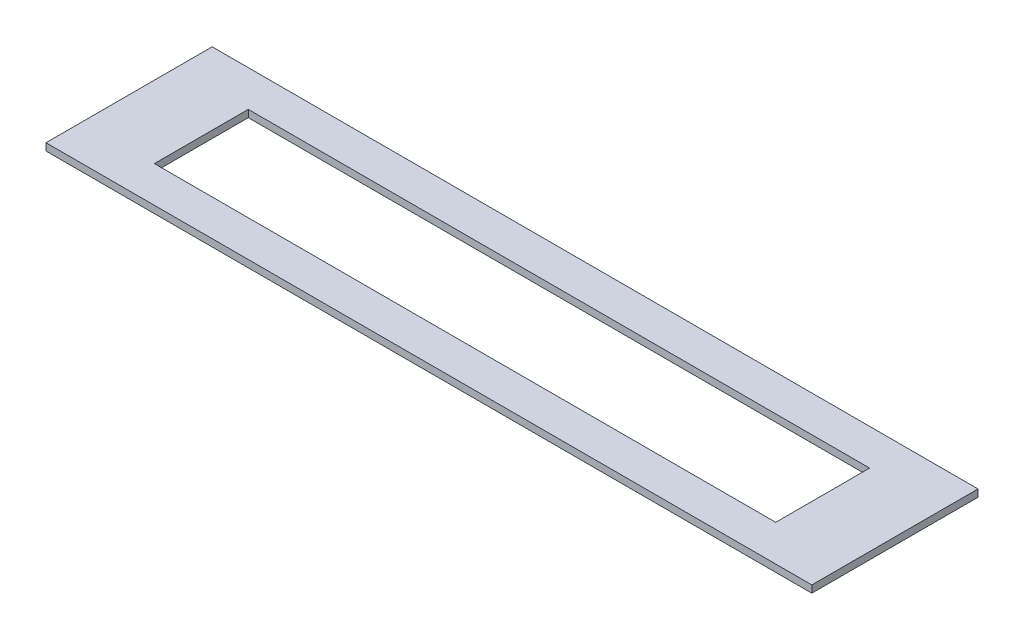
ISO-10303-21;
HEADER;
FILE_DESCRIPTION(('STEP AP214'),'2;1');
FILE_NAME('part.step','',(''),(''),'','','');
FILE_SCHEMA(('AUTOMOTIVE_DESIGN { 1 0 10303 214 1 1 1 1 }'));
ENDSEC;
DATA;
#1=APPLICATION_CONTEXT('core data for automotive mechanical design processes');
#2=APPLICATION_PROTOCOL_DEFINITION('international standard','automotive_design',2000,#1);
#3=PRODUCT_CONTEXT('',#1,'mechanical');
#4=PRODUCT('Part','Part','',(#3));
#5=PRODUCT_RELATED_PRODUCT_CATEGORY('part','',(#4));
#6=PRODUCT_DEFINITION_FORMATION('','',#4);
#7=PRODUCT_DEFINITION_CONTEXT('part definition',#1,'design');
#8=PRODUCT_DEFINITION('design','',#6,#7);
#9=PRODUCT_DEFINITION_SHAPE('','',#8);
#10=(LENGTH_UNIT() NAMED_UNIT(*) SI_UNIT(.MILLI.,.METRE.));
#11=(NAMED_UNIT(*) PLANE_ANGLE_UNIT() SI_UNIT($,.RADIAN.));
#12=(NAMED_UNIT(*) SI_UNIT($,.STERADIAN.) SOLID_ANGLE_UNIT());
#13=UNCERTAINTY_MEASURE_WITH_UNIT(LENGTH_MEASURE(1.E-05),#10,'distance_accuracy_value','');
#14=(GEOMETRIC_REPRESENTATION_CONTEXT(3) GLOBAL_UNCERTAINTY_ASSIGNED_CONTEXT((#13)) GLOBAL_UNIT_ASSIGNED_CONTEXT((#10,
#11,#12)) REPRESENTATION_CONTEXT('',''));
#15=CARTESIAN_POINT('',(0.,0.,0.));
#16=DIRECTION('',(0.,0.,1.));
#17=DIRECTION('',(1.,0.,0.));
#18=AXIS2_PLACEMENT_3D('',#15,#16,#17);
#19=CARTESIAN_POINT('',(0.,5.,0.));
#20=DIRECTION('',(0.,-1.,0.));
#21=DIRECTION('',(0.,0.,-1.));
#22=AXIS2_PLACEMENT_3D('',#19,#20,#21);
#23=PLANE('',#22);
#24=DIRECTION('',(0.,0.,1.));
#25=VECTOR('',#24,1.);
#26=CARTESIAN_POINT('',(0.,5.,0.));
#27=LINE('',#26,#25);
#28=CARTESIAN_POINT('',(-1.11022302462516E-13,5.,-115.));
#29=VERTEX_POINT('',#28);
#30=CARTESIAN_POINT('',(0.,5.,0.));
#31=VERTEX_POINT('',#30);
#32=EDGE_CURVE('E134',#29,#31,#27,.T.);
#33=ORIENTED_EDGE('',*,*,#32,.T.);
#34=DIRECTION('',(1.,0.,0.));
#35=VECTOR('',#34,1.);
#36=CARTESIAN_POINT('',(0.,5.,0.));
#37=LINE('',#36,#35);
#38=CARTESIAN_POINT('',(530.,5.,0.));
#39=VERTEX_POINT('',#38);
#40=EDGE_CURVE('E137',#31,#39,#37,.T.);
#41=ORIENTED_EDGE('',*,*,#40,.T.);
#42=DIRECTION('',(0.,0.,-1.));
#43=VECTOR('',#42,1.);
#44=CARTESIAN_POINT('',(530.,5.,0.));
#45=LINE('',#44,#43);
#46=CARTESIAN_POINT('',(530.,5.,-115.));
#47=VERTEX_POINT('',#46);
#48=EDGE_CURVE('E140',#39,#47,#45,.T.);
#49=ORIENTED_EDGE('',*,*,#48,.T.);
#50=DIRECTION('',(-1.,0.,0.));
#51=VECTOR('',#50,1.);
#52=CARTESIAN_POINT('',(-1.11022302462516E-13,5.,-115.));
#53=LINE('',#52,#51);
#54=EDGE_CURVE('E142',#47,#29,#53,.T.);
#55=ORIENTED_EDGE('',*,*,#54,.T.);
#56=EDGE_LOOP('',(#33,#41,#49,#55));
#57=FACE_BOUND('',#56,.T.);
#58=DIRECTION('',(0.,0.,1.));
#59=VECTOR('',#58,1.);
#60=CARTESIAN_POINT('',(50.,5.,-90.));
#61=LINE('',#60,#59);
#62=CARTESIAN_POINT('',(50.,5.,-90.));
#63=VERTEX_POINT('',#62);
#64=CARTESIAN_POINT('',(50.,5.,-25.));
#65=VERTEX_POINT('',#64);
#66=EDGE_CURVE('E98',#63,#65,#61,.T.);
#67=ORIENTED_EDGE('',*,*,#66,.F.);
#68=DIRECTION('',(-1.,0.,0.));
#69=VECTOR('',#68,1.);
#70=CARTESIAN_POINT('',(50.,5.,-90.));
#71=LINE('',#70,#69);
#72=CARTESIAN_POINT('',(480.,5.,-90.));
#73=VERTEX_POINT('',#72);
#74=EDGE_CURVE('E120',#73,#63,#71,.T.);
#75=ORIENTED_EDGE('',*,*,#74,.F.);
#76=DIRECTION('',(0.,0.,-1.));
#77=VECTOR('',#76,1.);
#78=CARTESIAN_POINT('',(480.,5.,-90.));
#79=LINE('',#78,#77);
#80=CARTESIAN_POINT('',(480.,5.,-25.));
#81=VERTEX_POINT('',#80);
#82=EDGE_CURVE('E118',#81,#73,#79,.T.);
#83=ORIENTED_EDGE('',*,*,#82,.F.);
#84=DIRECTION('',(1.,0.,0.));
#85=VECTOR('',#84,1.);
#86=CARTESIAN_POINT('',(50.,5.,-25.));
#87=LINE('',#86,#85);
#88=EDGE_CURVE('E106',#65,#81,#87,.T.);
#89=ORIENTED_EDGE('',*,*,#88,.F.);
#90=EDGE_LOOP('',(#67,#75,#83,#89));
#91=FACE_BOUND('',#90,.T.);
#92=ADVANCED_FACE('F33',(#57,#91),#23,.F.);
#93=CARTESIAN_POINT('',(0.,0.,0.));
#94=DIRECTION('',(0.,-1.,0.));
#95=DIRECTION('',(0.,0.,-1.));
#96=AXIS2_PLACEMENT_3D('',#93,#94,#95);
#97=PLANE('',#96);
#98=DIRECTION('',(0.,0.,1.));
#99=VECTOR('',#98,1.);
#100=CARTESIAN_POINT('',(0.,0.,0.));
#101=LINE('',#100,#99);
#102=CARTESIAN_POINT('',(-1.11022302462516E-13,0.,-115.));
#103=VERTEX_POINT('',#102);
#104=CARTESIAN_POINT('',(0.,0.,0.));
#105=VERTEX_POINT('',#104);
#106=EDGE_CURVE('E114',#103,#105,#101,.T.);
#107=ORIENTED_EDGE('',*,*,#106,.F.);
#108=DIRECTION('',(-1.,0.,0.));
#109=VECTOR('',#108,1.);
#110=CARTESIAN_POINT('',(-1.11022302462516E-13,0.,-115.));
#111=LINE('',#110,#109);
#112=CARTESIAN_POINT('',(530.,0.,-115.));
#113=VERTEX_POINT('',#112);
#114=EDGE_CURVE('E138',#113,#103,#111,.T.);
#115=ORIENTED_EDGE('',*,*,#114,.F.);
#116=DIRECTION('',(0.,0.,-1.));
#117=VECTOR('',#116,1.);
#118=CARTESIAN_POINT('',(530.,0.,0.));
#119=LINE('',#118,#117);
#120=CARTESIAN_POINT('',(530.,0.,0.));
#121=VERTEX_POINT('',#120);
#122=EDGE_CURVE('E149',#121,#113,#119,.T.);
#123=ORIENTED_EDGE('',*,*,#122,.F.);
#124=DIRECTION('',(1.,0.,0.));
#125=VECTOR('',#124,1.);
#126=CARTESIAN_POINT('',(0.,0.,0.));
#127=LINE('',#126,#125);
#128=EDGE_CURVE('E147',#105,#121,#127,.T.);
#129=ORIENTED_EDGE('',*,*,#128,.F.);
#130=EDGE_LOOP('',(#107,#115,#123,#129));
#131=FACE_BOUND('',#130,.T.);
#132=DIRECTION('',(-1.,0.,0.));
#133=VECTOR('',#132,1.);
#134=CARTESIAN_POINT('',(50.,0.,-90.));
#135=LINE('',#134,#133);
#136=CARTESIAN_POINT('',(480.,0.,-90.));
#137=VERTEX_POINT('',#136);
#138=CARTESIAN_POINT('',(50.,0.,-90.));
#139=VERTEX_POINT('',#138);
#140=EDGE_CURVE('E107',#137,#139,#135,.T.);
#141=ORIENTED_EDGE('',*,*,#140,.T.);
#142=DIRECTION('',(0.,0.,1.));
#143=VECTOR('',#142,1.);
#144=CARTESIAN_POINT('',(50.,0.,-90.));
#145=LINE('',#144,#143);
#146=CARTESIAN_POINT('',(50.,0.,-25.));
#147=VERTEX_POINT('',#146);
#148=EDGE_CURVE('E56',#139,#147,#145,.T.);
#149=ORIENTED_EDGE('',*,*,#148,.T.);
#150=DIRECTION('',(1.,0.,0.));
#151=VECTOR('',#150,1.);
#152=CARTESIAN_POINT('',(50.,0.,-25.));
#153=LINE('',#152,#151);
#154=CARTESIAN_POINT('',(480.,0.,-25.));
#155=VERTEX_POINT('',#154);
#156=EDGE_CURVE('E113',#147,#155,#153,.T.);
#157=ORIENTED_EDGE('',*,*,#156,.T.);
#158=DIRECTION('',(0.,0.,-1.));
#159=VECTOR('',#158,1.);
#160=CARTESIAN_POINT('',(480.,0.,-90.));
#161=LINE('',#160,#159);
#162=EDGE_CURVE('E126',#155,#137,#161,.T.);
#163=ORIENTED_EDGE('',*,*,#162,.T.);
#164=EDGE_LOOP('',(#141,#149,#157,#163));
#165=FACE_BOUND('',#164,.T.);
#166=ADVANCED_FACE('F167',(#131,#165),#97,.T.);
#167=CARTESIAN_POINT('',(0.,5.,0.));
#168=DIRECTION('',(1.,0.,0.));
#169=DIRECTION('',(0.,0.,-1.));
#170=AXIS2_PLACEMENT_3D('',#167,#168,#169);
#171=PLANE('',#170);
#172=ORIENTED_EDGE('',*,*,#106,.T.);
#173=DIRECTION('',(0.,-1.,0.));
#174=VECTOR('',#173,1.);
#175=CARTESIAN_POINT('',(0.,5.,0.));
#176=LINE('',#175,#174);
#177=EDGE_CURVE('E11',#31,#105,#176,.T.);
#178=ORIENTED_EDGE('',*,*,#177,.F.);
#179=ORIENTED_EDGE('',*,*,#32,.F.);
#180=DIRECTION('',(0.,-1.,0.));
#181=VECTOR('',#180,1.);
#182=CARTESIAN_POINT('',(-1.11022302462516E-13,5.,-115.));
#183=LINE('',#182,#181);
#184=EDGE_CURVE('E144',#29,#103,#183,.T.);
#185=ORIENTED_EDGE('',*,*,#184,.T.);
#186=EDGE_LOOP('',(#172,#178,#179,#185));
#187=FACE_BOUND('',#186,.T.);
#188=ADVANCED_FACE('F35',(#187),#171,.F.);
#189=CARTESIAN_POINT('',(0.,5.,0.));
#190=DIRECTION('',(0.,0.,-1.));
#191=DIRECTION('',(-1.,0.,0.));
#192=AXIS2_PLACEMENT_3D('',#189,#190,#191);
#193=PLANE('',#192);
#194=ORIENTED_EDGE('',*,*,#128,.T.);
#195=DIRECTION('',(0.,-1.,0.));
#196=VECTOR('',#195,1.);
#197=CARTESIAN_POINT('',(530.,5.,0.));
#198=LINE('',#197,#196);
#199=EDGE_CURVE('E41',#39,#121,#198,.T.);
#200=ORIENTED_EDGE('',*,*,#199,.F.);
#201=ORIENTED_EDGE('',*,*,#40,.F.);
#202=ORIENTED_EDGE('',*,*,#177,.T.);
#203=EDGE_LOOP('',(#194,#200,#201,#202));
#204=FACE_BOUND('',#203,.T.);
#205=ADVANCED_FACE('F177',(#204),#193,.F.);
#206=CARTESIAN_POINT('',(530.,5.,0.));
#207=DIRECTION('',(-1.,0.,0.));
#208=DIRECTION('',(0.,0.,1.));
#209=AXIS2_PLACEMENT_3D('',#206,#207,#208);
#210=PLANE('',#209);
#211=ORIENTED_EDGE('',*,*,#122,.T.);
#212=DIRECTION('',(0.,-1.,0.));
#213=VECTOR('',#212,1.);
#214=CARTESIAN_POINT('',(530.,5.,-115.));
#215=LINE('',#214,#213);
#216=EDGE_CURVE('E154',#47,#113,#215,.T.);
#217=ORIENTED_EDGE('',*,*,#216,.F.);
#218=ORIENTED_EDGE('',*,*,#48,.F.);
#219=ORIENTED_EDGE('',*,*,#199,.T.);
#220=EDGE_LOOP('',(#211,#217,#218,#219));
#221=FACE_BOUND('',#220,.T.);
#222=ADVANCED_FACE('F161',(#221),#210,.F.);
#223=CARTESIAN_POINT('',(-1.11022302462516E-13,5.,-115.));
#224=DIRECTION('',(0.,0.,1.));
#225=DIRECTION('',(1.,0.,0.));
#226=AXIS2_PLACEMENT_3D('',#223,#224,#225);
#227=PLANE('',#226);
#228=ORIENTED_EDGE('',*,*,#114,.T.);
#229=ORIENTED_EDGE('',*,*,#184,.F.);
#230=ORIENTED_EDGE('',*,*,#54,.F.);
#231=ORIENTED_EDGE('',*,*,#216,.T.);
#232=EDGE_LOOP('',(#228,#229,#230,#231));
#233=FACE_BOUND('',#232,.T.);
#234=ADVANCED_FACE('F171',(#233),#227,.F.);
#235=CARTESIAN_POINT('',(50.,5.,-90.));
#236=DIRECTION('',(1.,0.,0.));
#237=DIRECTION('',(0.,0.,-1.));
#238=AXIS2_PLACEMENT_3D('',#235,#236,#237);
#239=PLANE('',#238);
#240=ORIENTED_EDGE('',*,*,#148,.F.);
#241=DIRECTION('',(0.,-1.,0.));
#242=VECTOR('',#241,1.);
#243=CARTESIAN_POINT('',(50.,5.,-90.));
#244=LINE('',#243,#242);
#245=EDGE_CURVE('E102',#63,#139,#244,.T.);
#246=ORIENTED_EDGE('',*,*,#245,.F.);
#247=ORIENTED_EDGE('',*,*,#66,.T.);
#248=DIRECTION('',(0.,-1.,0.));
#249=VECTOR('',#248,1.);
#250=CARTESIAN_POINT('',(50.,5.,-25.));
#251=LINE('',#250,#249);
#252=EDGE_CURVE('E101',#65,#147,#251,.T.);
#253=ORIENTED_EDGE('',*,*,#252,.T.);
#254=EDGE_LOOP('',(#240,#246,#247,#253));
#255=FACE_BOUND('',#254,.T.);
#256=ADVANCED_FACE('F100',(#255),#239,.T.);
#257=CARTESIAN_POINT('',(50.,5.,-25.));
#258=DIRECTION('',(0.,0.,-1.));
#259=DIRECTION('',(-1.,0.,0.));
#260=AXIS2_PLACEMENT_3D('',#257,#258,#259);
#261=PLANE('',#260);
#262=ORIENTED_EDGE('',*,*,#156,.F.);
#263=ORIENTED_EDGE('',*,*,#252,.F.);
#264=ORIENTED_EDGE('',*,*,#88,.T.);
#265=DIRECTION('',(0.,-1.,0.));
#266=VECTOR('',#265,1.);
#267=CARTESIAN_POINT('',(480.,5.,-25.));
#268=LINE('',#267,#266);
#269=EDGE_CURVE('E115',#81,#155,#268,.T.);
#270=ORIENTED_EDGE('',*,*,#269,.T.);
#271=EDGE_LOOP('',(#262,#263,#264,#270));
#272=FACE_BOUND('',#271,.T.);
#273=ADVANCED_FACE('F110',(#272),#261,.T.);
#274=CARTESIAN_POINT('',(480.,5.,-90.));
#275=DIRECTION('',(-1.,0.,0.));
#276=DIRECTION('',(0.,0.,1.));
#277=AXIS2_PLACEMENT_3D('',#274,#275,#276);
#278=PLANE('',#277);
#279=ORIENTED_EDGE('',*,*,#162,.F.);
#280=ORIENTED_EDGE('',*,*,#269,.F.);
#281=ORIENTED_EDGE('',*,*,#82,.T.);
#282=DIRECTION('',(0.,-1.,0.));
#283=VECTOR('',#282,1.);
#284=CARTESIAN_POINT('',(480.,5.,-90.));
#285=LINE('',#284,#283);
#286=EDGE_CURVE('E48',#73,#137,#285,.T.);
#287=ORIENTED_EDGE('',*,*,#286,.T.);
#288=EDGE_LOOP('',(#279,#280,#281,#287));
#289=FACE_BOUND('',#288,.T.);
#290=ADVANCED_FACE('F200',(#289),#278,.T.);
#291=CARTESIAN_POINT('',(50.,5.,-90.));
#292=DIRECTION('',(0.,0.,1.));
#293=DIRECTION('',(1.,0.,0.));
#294=AXIS2_PLACEMENT_3D('',#291,#292,#293);
#295=PLANE('',#294);
#296=ORIENTED_EDGE('',*,*,#140,.F.);
#297=ORIENTED_EDGE('',*,*,#286,.F.);
#298=ORIENTED_EDGE('',*,*,#74,.T.);
#299=ORIENTED_EDGE('',*,*,#245,.T.);
#300=EDGE_LOOP('',(#296,#297,#298,#299));
#301=FACE_BOUND('',#300,.T.);
#302=ADVANCED_FACE('F204',(#301),#295,.T.);
#303=CLOSED_SHELL('',(#92,#166,#188,#205,#222,#234,#256,#273,#290,#302));
#304=MANIFOLD_SOLID_BREP('B2',#303);
#305=ADVANCED_BREP_SHAPE_REPRESENTATION('',(#18,#304),#14);
#306=SHAPE_DEFINITION_REPRESENTATION(#9,#305);
ENDSEC;
END-ISO-10303-21;
